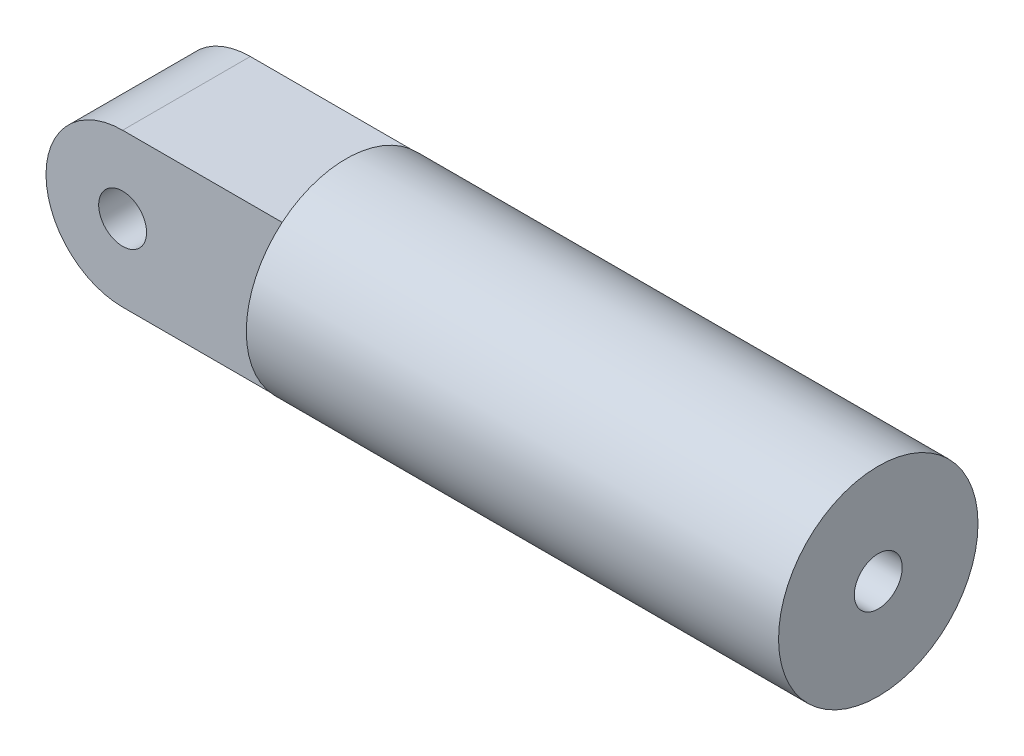
ISO-10303-21;
HEADER;
FILE_DESCRIPTION(('STEP AP214'),'2;1');
FILE_NAME('part.step','',(''),(''),'','','');
FILE_SCHEMA(('AUTOMOTIVE_DESIGN { 1 0 10303 214 1 1 1 1 }'));
ENDSEC;
DATA;
#1=APPLICATION_CONTEXT('core data for automotive mechanical design processes');
#2=APPLICATION_PROTOCOL_DEFINITION('international standard','automotive_design',2000,#1);
#3=PRODUCT_CONTEXT('',#1,'mechanical');
#4=PRODUCT('Part','Part','',(#3));
#5=PRODUCT_RELATED_PRODUCT_CATEGORY('part','',(#4));
#6=PRODUCT_DEFINITION_FORMATION('','',#4);
#7=PRODUCT_DEFINITION_CONTEXT('part definition',#1,'design');
#8=PRODUCT_DEFINITION('design','',#6,#7);
#9=PRODUCT_DEFINITION_SHAPE('','',#8);
#10=(LENGTH_UNIT() NAMED_UNIT(*) SI_UNIT(.MILLI.,.METRE.));
#11=(NAMED_UNIT(*) PLANE_ANGLE_UNIT() SI_UNIT($,.RADIAN.));
#12=(NAMED_UNIT(*) SI_UNIT($,.STERADIAN.) SOLID_ANGLE_UNIT());
#13=UNCERTAINTY_MEASURE_WITH_UNIT(LENGTH_MEASURE(1.E-05),#10,'distance_accuracy_value','');
#14=(GEOMETRIC_REPRESENTATION_CONTEXT(3) GLOBAL_UNCERTAINTY_ASSIGNED_CONTEXT((#13)) GLOBAL_UNIT_ASSIGNED_CONTEXT((#10,
#11,#12)) REPRESENTATION_CONTEXT('',''));
#15=CARTESIAN_POINT('',(0.,0.,0.));
#16=DIRECTION('',(0.,0.,1.));
#17=DIRECTION('',(1.,0.,0.));
#18=AXIS2_PLACEMENT_3D('',#15,#16,#17);
#19=CARTESIAN_POINT('',(0.,0.,0.));
#20=DIRECTION('',(1.,0.,0.));
#21=DIRECTION('',(0.,0.,-1.));
#22=AXIS2_PLACEMENT_3D('',#19,#20,#21);
#23=PLANE('',#22);
#24=DIRECTION('',(0.,1.,0.));
#25=VECTOR('',#24,1.);
#26=CARTESIAN_POINT('',(0.,-9.6017700321347,8.0035));
#27=LINE('',#26,#25);
#28=CARTESIAN_POINT('',(0.,-9.6017700321347,8.0035));
#29=VERTEX_POINT('',#28);
#30=CARTESIAN_POINT('',(0.,9.6017700321347,8.0035));
#31=VERTEX_POINT('',#30);
#32=EDGE_CURVE('E67',#29,#31,#27,.T.);
#33=ORIENTED_EDGE('',*,*,#32,.F.);
#34=CARTESIAN_POINT('',(0.,0.,0.));
#35=DIRECTION('',(1.,0.,0.));
#36=DIRECTION('',(0.,0.,-1.));
#37=AXIS2_PLACEMENT_3D('',#34,#35,#36);
#38=CIRCLE('',#37,12.5);
#39=EDGE_CURVE('E146',#31,#29,#38,.T.);
#40=ORIENTED_EDGE('',*,*,#39,.F.);
#41=EDGE_LOOP('',(#33,#40));
#42=FACE_BOUND('',#41,.T.);
#43=ADVANCED_FACE('F43',(#42),#23,.F.);
#44=DIRECTION('',(0.,0.,1.));
#45=VECTOR('',#44,1.);
#46=CARTESIAN_POINT('',(0.,-9.6017700321347,-8.0035));
#47=LINE('',#46,#45);
#48=CARTESIAN_POINT('',(0.,-9.6017700321347,-8.0035));
#49=VERTEX_POINT('',#48);
#50=EDGE_CURVE('E60',#49,#29,#47,.T.);
#51=ORIENTED_EDGE('',*,*,#50,.F.);
#52=EDGE_CURVE('E151',#29,#49,#38,.T.);
#53=ORIENTED_EDGE('',*,*,#52,.F.);
#54=EDGE_LOOP('',(#51,#53));
#55=FACE_BOUND('',#54,.T.);
#56=ADVANCED_FACE('F172',(#55),#23,.F.);
#57=DIRECTION('',(0.,-1.,0.));
#58=VECTOR('',#57,1.);
#59=CARTESIAN_POINT('',(0.,-9.6017700321347,-8.0035));
#60=LINE('',#59,#58);
#61=CARTESIAN_POINT('',(0.,9.6017700321347,-8.0035));
#62=VERTEX_POINT('',#61);
#63=EDGE_CURVE('E131',#62,#49,#60,.T.);
#64=ORIENTED_EDGE('',*,*,#63,.F.);
#65=EDGE_CURVE('E97',#49,#62,#38,.T.);
#66=ORIENTED_EDGE('',*,*,#65,.F.);
#67=EDGE_LOOP('',(#64,#66));
#68=FACE_BOUND('',#67,.T.);
#69=ADVANCED_FACE('F177',(#68),#23,.F.);
#70=DIRECTION('',(0.,0.,-1.));
#71=VECTOR('',#70,1.);
#72=CARTESIAN_POINT('',(0.,9.6017700321347,-8.0035));
#73=LINE('',#72,#71);
#74=EDGE_CURVE('E128',#31,#62,#73,.T.);
#75=ORIENTED_EDGE('',*,*,#74,.F.);
#76=EDGE_CURVE('E53',#62,#31,#38,.T.);
#77=ORIENTED_EDGE('',*,*,#76,.F.);
#78=EDGE_LOOP('',(#75,#77));
#79=FACE_BOUND('',#78,.T.);
#80=ADVANCED_FACE('F173',(#79),#23,.F.);
#81=CARTESIAN_POINT('',(66.71,0.,0.));
#82=DIRECTION('',(-1.,0.,0.));
#83=DIRECTION('',(0.,0.,1.));
#84=AXIS2_PLACEMENT_3D('',#81,#82,#83);
#85=CYLINDRICAL_SURFACE('',#84,12.5);
#86=CARTESIAN_POINT('',(66.71,0.,0.));
#87=DIRECTION('',(1.,0.,0.));
#88=DIRECTION('',(0.,0.,-1.));
#89=AXIS2_PLACEMENT_3D('',#86,#87,#88);
#90=CIRCLE('',#89,12.5);
#91=CARTESIAN_POINT('',(66.71,0.,-12.5));
#92=VERTEX_POINT('',#91);
#93=EDGE_CURVE('E11',#92,#92,#90,.T.);
#94=ORIENTED_EDGE('',*,*,#93,.F.);
#95=EDGE_LOOP('',(#94));
#96=FACE_BOUND('',#95,.T.);
#97=ORIENTED_EDGE('',*,*,#76,.T.);
#98=ORIENTED_EDGE('',*,*,#39,.T.);
#99=ORIENTED_EDGE('',*,*,#52,.T.);
#100=ORIENTED_EDGE('',*,*,#65,.T.);
#101=EDGE_LOOP('',(#97,#98,#99,#100));
#102=FACE_BOUND('',#101,.T.);
#103=ADVANCED_FACE('F45',(#96,#102),#85,.T.);
#104=CARTESIAN_POINT('',(66.71,0.,0.));
#105=DIRECTION('',(1.,0.,0.));
#106=DIRECTION('',(0.,0.,-1.));
#107=AXIS2_PLACEMENT_3D('',#104,#105,#106);
#108=PLANE('',#107);
#109=CARTESIAN_POINT('',(66.71,0.,0.));
#110=DIRECTION('',(1.,0.,0.));
#111=DIRECTION('',(0.,0.,-1.));
#112=AXIS2_PLACEMENT_3D('',#109,#110,#111);
#113=CIRCLE('',#112,3.);
#114=CARTESIAN_POINT('',(66.71,0.,-3.));
#115=VERTEX_POINT('',#114);
#116=EDGE_CURVE('E288',#115,#115,#113,.T.);
#117=ORIENTED_EDGE('',*,*,#116,.F.);
#118=EDGE_LOOP('',(#117));
#119=FACE_BOUND('',#118,.T.);
#120=ORIENTED_EDGE('',*,*,#93,.T.);
#121=EDGE_LOOP('',(#120));
#122=FACE_BOUND('',#121,.T.);
#123=ADVANCED_FACE('F185',(#119,#122),#108,.T.);
#124=CARTESIAN_POINT('',(-20.,-9.6017700321347,8.0035));
#125=DIRECTION('',(0.,0.,-1.));
#126=DIRECTION('',(-1.,0.,0.));
#127=AXIS2_PLACEMENT_3D('',#124,#125,#126);
#128=PLANE('',#127);
#129=CARTESIAN_POINT('',(-19.9999999999999,0.,8.0035));
#130=DIRECTION('',(0.,0.,1.));
#131=DIRECTION('',(1.,0.,0.));
#132=AXIS2_PLACEMENT_3D('',#129,#130,#131);
#133=CIRCLE('',#132,3.);
#134=CARTESIAN_POINT('',(-16.9999999999999,0.,8.0035));
#135=VERTEX_POINT('',#134);
#136=EDGE_CURVE('E120',#135,#135,#133,.T.);
#137=ORIENTED_EDGE('',*,*,#136,.F.);
#138=EDGE_LOOP('',(#137));
#139=FACE_BOUND('',#138,.T.);
#140=ORIENTED_EDGE('',*,*,#32,.T.);
#141=DIRECTION('',(1.,0.,0.));
#142=VECTOR('',#141,1.);
#143=CARTESIAN_POINT('',(-20.,9.6017700321347,8.0035));
#144=LINE('',#143,#142);
#145=CARTESIAN_POINT('',(-20.,9.6017700321347,8.0035));
#146=VERTEX_POINT('',#145);
#147=EDGE_CURVE('E88',#146,#31,#144,.T.);
#148=ORIENTED_EDGE('',*,*,#147,.F.);
#149=CARTESIAN_POINT('',(-20.,0.,8.0035));
#150=DIRECTION('',(0.,0.,1.));
#151=DIRECTION('',(1.,0.,0.));
#152=AXIS2_PLACEMENT_3D('',#149,#150,#151);
#153=CIRCLE('',#152,9.6017700321347);
#154=CARTESIAN_POINT('',(-20.,-9.6017700321347,8.0035));
#155=VERTEX_POINT('',#154);
#156=EDGE_CURVE('E93',#146,#155,#153,.T.);
#157=ORIENTED_EDGE('',*,*,#156,.T.);
#158=DIRECTION('',(1.,0.,0.));
#159=VECTOR('',#158,1.);
#160=CARTESIAN_POINT('',(-20.,-9.6017700321347,8.0035));
#161=LINE('',#160,#159);
#162=EDGE_CURVE('E125',#155,#29,#161,.T.);
#163=ORIENTED_EDGE('',*,*,#162,.T.);
#164=EDGE_LOOP('',(#140,#148,#157,#163));
#165=FACE_BOUND('',#164,.T.);
#166=ADVANCED_FACE('F90',(#139,#165),#128,.F.);
#167=CARTESIAN_POINT('',(-20.,9.6017700321347,-8.0035));
#168=DIRECTION('',(0.,-1.,0.));
#169=DIRECTION('',(0.,0.,-1.));
#170=AXIS2_PLACEMENT_3D('',#167,#168,#169);
#171=PLANE('',#170);
#172=ORIENTED_EDGE('',*,*,#74,.T.);
#173=DIRECTION('',(1.,0.,0.));
#174=VECTOR('',#173,1.);
#175=CARTESIAN_POINT('',(-20.,9.6017700321347,-8.0035));
#176=LINE('',#175,#174);
#177=CARTESIAN_POINT('',(-20.,9.6017700321347,-8.0035));
#178=VERTEX_POINT('',#177);
#179=EDGE_CURVE('E98',#178,#62,#176,.T.);
#180=ORIENTED_EDGE('',*,*,#179,.F.);
#181=DIRECTION('',(0.,0.,-1.));
#182=VECTOR('',#181,1.);
#183=CARTESIAN_POINT('',(-20.,9.6017700321347,-8.0035));
#184=LINE('',#183,#182);
#185=EDGE_CURVE('E101',#146,#178,#184,.T.);
#186=ORIENTED_EDGE('',*,*,#185,.F.);
#187=ORIENTED_EDGE('',*,*,#147,.T.);
#188=EDGE_LOOP('',(#172,#180,#186,#187));
#189=FACE_BOUND('',#188,.T.);
#190=ADVANCED_FACE('F102',(#189),#171,.F.);
#191=CARTESIAN_POINT('',(-20.,-9.6017700321347,-8.0035));
#192=DIRECTION('',(0.,0.,1.));
#193=DIRECTION('',(1.,0.,0.));
#194=AXIS2_PLACEMENT_3D('',#191,#192,#193);
#195=PLANE('',#194);
#196=CARTESIAN_POINT('',(-19.9999999999999,0.,-8.0035));
#197=DIRECTION('',(0.,0.,1.));
#198=DIRECTION('',(1.,0.,0.));
#199=AXIS2_PLACEMENT_3D('',#196,#197,#198);
#200=CIRCLE('',#199,3.);
#201=CARTESIAN_POINT('',(-16.9999999999999,0.,-8.0035));
#202=VERTEX_POINT('',#201);
#203=EDGE_CURVE('E47',#202,#202,#200,.T.);
#204=ORIENTED_EDGE('',*,*,#203,.T.);
#205=EDGE_LOOP('',(#204));
#206=FACE_BOUND('',#205,.T.);
#207=ORIENTED_EDGE('',*,*,#63,.T.);
#208=DIRECTION('',(1.,0.,0.));
#209=VECTOR('',#208,1.);
#210=CARTESIAN_POINT('',(-20.,-9.6017700321347,-8.0035));
#211=LINE('',#210,#209);
#212=CARTESIAN_POINT('',(-20.,-9.6017700321347,-8.0035));
#213=VERTEX_POINT('',#212);
#214=EDGE_CURVE('E139',#213,#49,#211,.T.);
#215=ORIENTED_EDGE('',*,*,#214,.F.);
#216=CARTESIAN_POINT('',(-20.,0.,-8.0035));
#217=DIRECTION('',(0.,0.,1.));
#218=DIRECTION('',(1.,0.,0.));
#219=AXIS2_PLACEMENT_3D('',#216,#217,#218);
#220=CIRCLE('',#219,9.6017700321347);
#221=EDGE_CURVE('E114',#178,#213,#220,.T.);
#222=ORIENTED_EDGE('',*,*,#221,.F.);
#223=ORIENTED_EDGE('',*,*,#179,.T.);
#224=EDGE_LOOP('',(#207,#215,#222,#223));
#225=FACE_BOUND('',#224,.T.);
#226=ADVANCED_FACE('F157',(#206,#225),#195,.F.);
#227=CARTESIAN_POINT('',(-20.,-9.6017700321347,-8.0035));
#228=DIRECTION('',(0.,1.,0.));
#229=DIRECTION('',(0.,0.,1.));
#230=AXIS2_PLACEMENT_3D('',#227,#228,#229);
#231=PLANE('',#230);
#232=ORIENTED_EDGE('',*,*,#50,.T.);
#233=ORIENTED_EDGE('',*,*,#162,.F.);
#234=DIRECTION('',(0.,0.,1.));
#235=VECTOR('',#234,1.);
#236=CARTESIAN_POINT('',(-20.,-9.6017700321347,-8.0035));
#237=LINE('',#236,#235);
#238=EDGE_CURVE('E108',#213,#155,#237,.T.);
#239=ORIENTED_EDGE('',*,*,#238,.F.);
#240=ORIENTED_EDGE('',*,*,#214,.T.);
#241=EDGE_LOOP('',(#232,#233,#239,#240));
#242=FACE_BOUND('',#241,.T.);
#243=ADVANCED_FACE('F160',(#242),#231,.F.);
#244=CARTESIAN_POINT('',(-20.,0.,-8.0035));
#245=DIRECTION('',(0.,0.,1.));
#246=DIRECTION('',(1.,0.,0.));
#247=AXIS2_PLACEMENT_3D('',#244,#245,#246);
#248=CYLINDRICAL_SURFACE('',#247,9.6017700321347);
#249=ORIENTED_EDGE('',*,*,#156,.F.);
#250=ORIENTED_EDGE('',*,*,#185,.T.);
#251=ORIENTED_EDGE('',*,*,#221,.T.);
#252=ORIENTED_EDGE('',*,*,#238,.T.);
#253=EDGE_LOOP('',(#249,#250,#251,#252));
#254=FACE_BOUND('',#253,.T.);
#255=ADVANCED_FACE('F111',(#254),#248,.T.);
#256=CARTESIAN_POINT('',(-19.9999999999999,0.,-12.5));
#257=DIRECTION('',(0.,0.,1.));
#258=DIRECTION('',(1.,0.,0.));
#259=AXIS2_PLACEMENT_3D('',#256,#257,#258);
#260=CYLINDRICAL_SURFACE('',#259,3.);
#261=ORIENTED_EDGE('',*,*,#136,.T.);
#262=EDGE_LOOP('',(#261));
#263=FACE_BOUND('',#262,.T.);
#264=ORIENTED_EDGE('',*,*,#203,.F.);
#265=EDGE_LOOP('',(#264));
#266=FACE_BOUND('',#265,.T.);
#267=ADVANCED_FACE('F167',(#263,#266),#260,.F.);
#268=CARTESIAN_POINT('',(51.71,0.,0.));
#269=DIRECTION('',(1.,0.,0.));
#270=DIRECTION('',(0.,0.,-1.));
#271=AXIS2_PLACEMENT_3D('',#268,#269,#270);
#272=CYLINDRICAL_SURFACE('',#271,3.);
#273=CARTESIAN_POINT('',(51.71,0.,0.));
#274=DIRECTION('',(1.,0.,0.));
#275=DIRECTION('',(0.,0.,-1.));
#276=AXIS2_PLACEMENT_3D('',#273,#274,#275);
#277=CIRCLE('',#276,3.);
#278=CARTESIAN_POINT('',(51.71,0.,-3.));
#279=VERTEX_POINT('',#278);
#280=EDGE_CURVE('E286',#279,#279,#277,.T.);
#281=ORIENTED_EDGE('',*,*,#280,.F.);
#282=EDGE_LOOP('',(#281));
#283=FACE_BOUND('',#282,.T.);
#284=ORIENTED_EDGE('',*,*,#116,.T.);
#285=EDGE_LOOP('',(#284));
#286=FACE_BOUND('',#285,.T.);
#287=ADVANCED_FACE('F246',(#283,#286),#272,.F.);
#288=CARTESIAN_POINT('',(51.71,0.,0.));
#289=DIRECTION('',(1.,0.,0.));
#290=DIRECTION('',(0.,0.,-1.));
#291=AXIS2_PLACEMENT_3D('',#288,#289,#290);
#292=PLANE('',#291);
#293=ORIENTED_EDGE('',*,*,#280,.T.);
#294=EDGE_LOOP('',(#293));
#295=FACE_BOUND('',#294,.T.);
#296=ADVANCED_FACE('F267',(#295),#292,.T.);
#297=CLOSED_SHELL('',(#43,#56,#69,#80,#103,#123,#166,#190,#226,#243,#255,#267,#287,#296));
#298=MANIFOLD_SOLID_BREP('B2',#297);
#299=ADVANCED_BREP_SHAPE_REPRESENTATION('',(#18,#298),#14);
#300=SHAPE_DEFINITION_REPRESENTATION(#9,#299);
ENDSEC;
END-ISO-10303-21;
